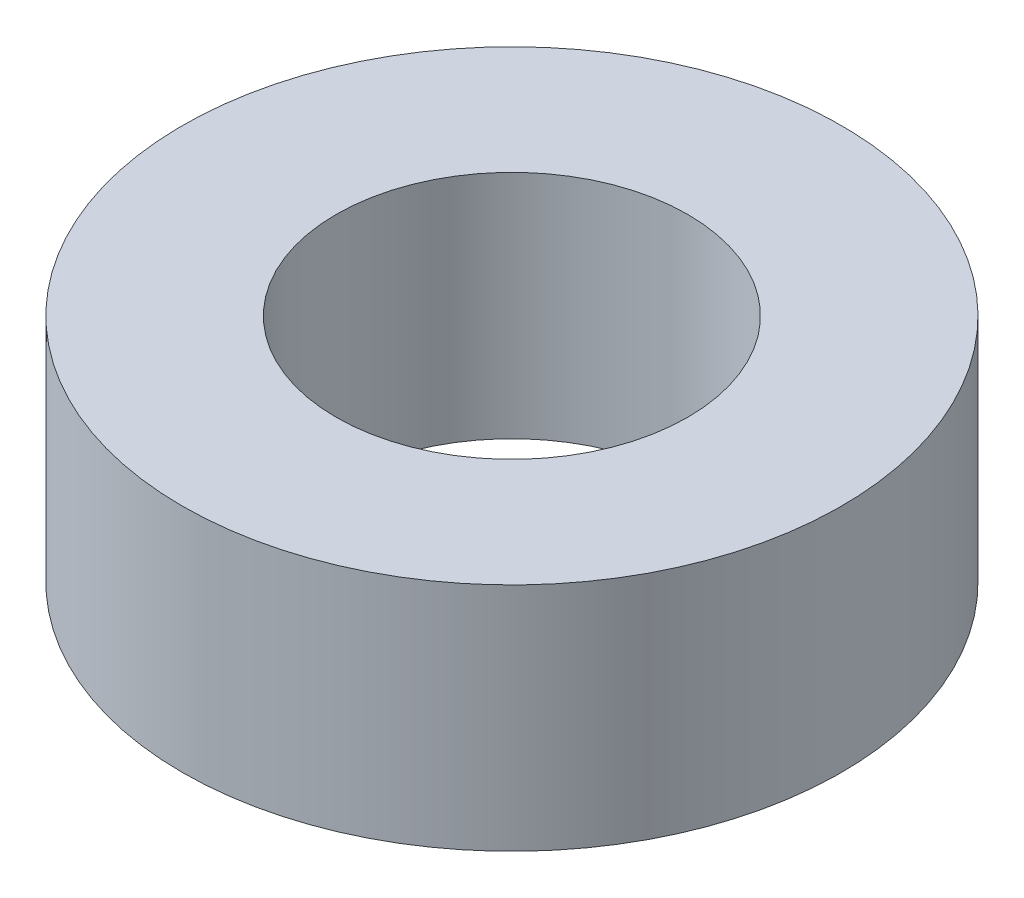
ISO-10303-21;
HEADER;
FILE_DESCRIPTION(('STEP AP214'),'2;1');
FILE_NAME('part.step','',(''),(''),'','','');
FILE_SCHEMA(('AUTOMOTIVE_DESIGN { 1 0 10303 214 1 1 1 1 }'));
ENDSEC;
DATA;
#1=APPLICATION_CONTEXT('core data for automotive mechanical design processes');
#2=APPLICATION_PROTOCOL_DEFINITION('international standard','automotive_design',2000,#1);
#3=PRODUCT_CONTEXT('',#1,'mechanical');
#4=PRODUCT('Part','Part','',(#3));
#5=PRODUCT_RELATED_PRODUCT_CATEGORY('part','',(#4));
#6=PRODUCT_DEFINITION_FORMATION('','',#4);
#7=PRODUCT_DEFINITION_CONTEXT('part definition',#1,'design');
#8=PRODUCT_DEFINITION('design','',#6,#7);
#9=PRODUCT_DEFINITION_SHAPE('','',#8);
#10=(LENGTH_UNIT() NAMED_UNIT(*) SI_UNIT(.MILLI.,.METRE.));
#11=(NAMED_UNIT(*) PLANE_ANGLE_UNIT() SI_UNIT($,.RADIAN.));
#12=(NAMED_UNIT(*) SI_UNIT($,.STERADIAN.) SOLID_ANGLE_UNIT());
#13=UNCERTAINTY_MEASURE_WITH_UNIT(LENGTH_MEASURE(1.E-05),#10,'distance_accuracy_value','');
#14=(GEOMETRIC_REPRESENTATION_CONTEXT(3) GLOBAL_UNCERTAINTY_ASSIGNED_CONTEXT((#13)) GLOBAL_UNIT_ASSIGNED_CONTEXT((#10,
#11,#12)) REPRESENTATION_CONTEXT('',''));
#15=CARTESIAN_POINT('',(0.,0.,0.));
#16=DIRECTION('',(0.,0.,1.));
#17=DIRECTION('',(1.,0.,0.));
#18=AXIS2_PLACEMENT_3D('',#15,#16,#17);
#19=CARTESIAN_POINT('',(-5.07538834601945,2.1,-2.78377360796824));
#20=DIRECTION('',(0.,-1.,0.));
#21=DIRECTION('',(0.,0.,-1.));
#22=AXIS2_PLACEMENT_3D('',#19,#20,#21);
#23=CYLINDRICAL_SURFACE('',#22,3.);
#24=CARTESIAN_POINT('',(-5.07538834601945,2.1,-2.78377360796824));
#25=DIRECTION('',(0.,1.,0.));
#26=DIRECTION('',(0.,0.,1.));
#27=AXIS2_PLACEMENT_3D('',#24,#25,#26);
#28=CIRCLE('',#27,3.);
#29=CARTESIAN_POINT('',(-5.07538834601945,2.1,0.21622639203176));
#30=VERTEX_POINT('',#29);
#31=EDGE_CURVE('E10',#30,#30,#28,.T.);
#32=ORIENTED_EDGE('',*,*,#31,.F.);
#33=EDGE_LOOP('',(#32));
#34=FACE_BOUND('',#33,.T.);
#35=CARTESIAN_POINT('',(-5.07538834601945,0.,-2.78377360796824));
#36=DIRECTION('',(0.,1.,0.));
#37=DIRECTION('',(0.,0.,1.));
#38=AXIS2_PLACEMENT_3D('',#35,#36,#37);
#39=CIRCLE('',#38,3.);
#40=CARTESIAN_POINT('',(-5.07538834601945,0.,0.21622639203176));
#41=VERTEX_POINT('',#40);
#42=EDGE_CURVE('E21',#41,#41,#39,.T.);
#43=ORIENTED_EDGE('',*,*,#42,.T.);
#44=EDGE_LOOP('',(#43));
#45=FACE_BOUND('',#44,.T.);
#46=ADVANCED_FACE('F14',(#34,#45),#23,.T.);
#47=CARTESIAN_POINT('',(-5.07538834601945,2.1,-2.78377360796824));
#48=DIRECTION('',(0.,1.,0.));
#49=DIRECTION('',(0.,0.,1.));
#50=AXIS2_PLACEMENT_3D('',#47,#48,#49);
#51=PLANE('',#50);
#52=CARTESIAN_POINT('',(-5.07538834601945,2.1,-2.78377360796824));
#53=DIRECTION('',(0.,1.,0.));
#54=DIRECTION('',(0.,0.,1.));
#55=AXIS2_PLACEMENT_3D('',#52,#53,#54);
#56=CIRCLE('',#55,1.6);
#57=CARTESIAN_POINT('',(-5.07538834601945,2.1,-1.18377360796824));
#58=VERTEX_POINT('',#57);
#59=EDGE_CURVE('E27',#58,#58,#56,.T.);
#60=ORIENTED_EDGE('',*,*,#59,.F.);
#61=EDGE_LOOP('',(#60));
#62=FACE_BOUND('',#61,.T.);
#63=ORIENTED_EDGE('',*,*,#31,.T.);
#64=EDGE_LOOP('',(#63));
#65=FACE_BOUND('',#64,.T.);
#66=ADVANCED_FACE('F45',(#62,#65),#51,.T.);
#67=CARTESIAN_POINT('',(-5.07538834601945,0.,-2.78377360796824));
#68=DIRECTION('',(0.,1.,0.));
#69=DIRECTION('',(0.,0.,1.));
#70=AXIS2_PLACEMENT_3D('',#67,#68,#69);
#71=PLANE('',#70);
#72=CARTESIAN_POINT('',(-5.07538834601945,0.,-2.78377360796824));
#73=DIRECTION('',(0.,1.,0.));
#74=DIRECTION('',(0.,0.,1.));
#75=AXIS2_PLACEMENT_3D('',#72,#73,#74);
#76=CIRCLE('',#75,1.6);
#77=CARTESIAN_POINT('',(-5.07538834601945,0.,-1.18377360796824));
#78=VERTEX_POINT('',#77);
#79=EDGE_CURVE('E17',#78,#78,#76,.T.);
#80=ORIENTED_EDGE('',*,*,#79,.T.);
#81=EDGE_LOOP('',(#80));
#82=FACE_BOUND('',#81,.T.);
#83=ORIENTED_EDGE('',*,*,#42,.F.);
#84=EDGE_LOOP('',(#83));
#85=FACE_BOUND('',#84,.T.);
#86=ADVANCED_FACE('F34',(#82,#85),#71,.F.);
#87=CARTESIAN_POINT('',(-5.07538834601945,-3.,-2.78377360796824));
#88=DIRECTION('',(0.,1.,0.));
#89=DIRECTION('',(0.,0.,1.));
#90=AXIS2_PLACEMENT_3D('',#87,#88,#89);
#91=CYLINDRICAL_SURFACE('',#90,1.6);
#92=ORIENTED_EDGE('',*,*,#59,.T.);
#93=EDGE_LOOP('',(#92));
#94=FACE_BOUND('',#93,.T.);
#95=ORIENTED_EDGE('',*,*,#79,.F.);
#96=EDGE_LOOP('',(#95));
#97=FACE_BOUND('',#96,.T.);
#98=ADVANCED_FACE('F37',(#94,#97),#91,.F.);
#99=CLOSED_SHELL('',(#46,#66,#86,#98));
#100=MANIFOLD_SOLID_BREP('B1',#99);
#101=ADVANCED_BREP_SHAPE_REPRESENTATION('',(#18,#100),#14);
#102=SHAPE_DEFINITION_REPRESENTATION(#9,#101);
ENDSEC;
END-ISO-10303-21;
